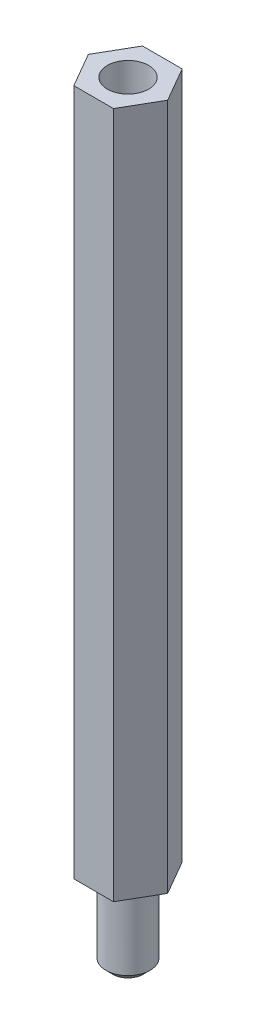
ISO-10303-21;
HEADER;
FILE_DESCRIPTION(('STEP AP214'),'2;1');
FILE_NAME('part.step','',(''),(''),'','','');
FILE_SCHEMA(('AUTOMOTIVE_DESIGN { 1 0 10303 214 1 1 1 1 }'));
ENDSEC;
DATA;
#1=APPLICATION_CONTEXT('core data for automotive mechanical design processes');
#2=APPLICATION_PROTOCOL_DEFINITION('international standard','automotive_design',2000,#1);
#3=PRODUCT_CONTEXT('',#1,'mechanical');
#4=PRODUCT('Part','Part','',(#3));
#5=PRODUCT_RELATED_PRODUCT_CATEGORY('part','',(#4));
#6=PRODUCT_DEFINITION_FORMATION('','',#4);
#7=PRODUCT_DEFINITION_CONTEXT('part definition',#1,'design');
#8=PRODUCT_DEFINITION('design','',#6,#7);
#9=PRODUCT_DEFINITION_SHAPE('','',#8);
#10=(LENGTH_UNIT() NAMED_UNIT(*) SI_UNIT(.MILLI.,.METRE.));
#11=(NAMED_UNIT(*) PLANE_ANGLE_UNIT() SI_UNIT($,.RADIAN.));
#12=(NAMED_UNIT(*) SI_UNIT($,.STERADIAN.) SOLID_ANGLE_UNIT());
#13=UNCERTAINTY_MEASURE_WITH_UNIT(LENGTH_MEASURE(1.E-05),#10,'distance_accuracy_value','');
#14=(GEOMETRIC_REPRESENTATION_CONTEXT(3) GLOBAL_UNCERTAINTY_ASSIGNED_CONTEXT((#13)) GLOBAL_UNIT_ASSIGNED_CONTEXT((#10,
#11,#12)) REPRESENTATION_CONTEXT('',''));
#15=CARTESIAN_POINT('',(0.,0.,0.));
#16=DIRECTION('',(0.,0.,1.));
#17=DIRECTION('',(1.,0.,0.));
#18=AXIS2_PLACEMENT_3D('',#15,#16,#17);
#19=CARTESIAN_POINT('',(0.,50.,0.));
#20=DIRECTION('',(0.,-1.,0.));
#21=DIRECTION('',(0.,0.,-1.));
#22=AXIS2_PLACEMENT_3D('',#19,#20,#21);
#23=CYLINDRICAL_SURFACE('',#22,1.5);
#24=CARTESIAN_POINT('',(0.,23.,0.));
#25=DIRECTION('',(0.,-1.,0.));
#26=DIRECTION('',(0.,0.,-1.));
#27=AXIS2_PLACEMENT_3D('',#24,#25,#26);
#28=CIRCLE('',#27,1.5);
#29=CARTESIAN_POINT('',(0.,23.,-1.5));
#30=VERTEX_POINT('',#29);
#31=EDGE_CURVE('E43',#30,#30,#28,.T.);
#32=ORIENTED_EDGE('',*,*,#31,.T.);
#33=EDGE_LOOP('',(#32));
#34=FACE_BOUND('',#33,.T.);
#35=CARTESIAN_POINT('',(0.,50.,0.));
#36=DIRECTION('',(0.,1.,0.));
#37=DIRECTION('',(0.,0.,1.));
#38=AXIS2_PLACEMENT_3D('',#35,#36,#37);
#39=CIRCLE('',#38,1.5);
#40=CARTESIAN_POINT('',(0.,50.,1.5));
#41=VERTEX_POINT('',#40);
#42=EDGE_CURVE('E125',#41,#41,#39,.T.);
#43=ORIENTED_EDGE('',*,*,#42,.T.);
#44=EDGE_LOOP('',(#43));
#45=FACE_BOUND('',#44,.T.);
#46=ADVANCED_FACE('F34',(#34,#45),#23,.F.);
#47=CARTESIAN_POINT('',(0.,50.,-5.));
#48=DIRECTION('',(0.,1.,0.));
#49=DIRECTION('',(0.,0.,1.));
#50=AXIS2_PLACEMENT_3D('',#47,#48,#49);
#51=PLANE('',#50);
#52=DIRECTION('',(-0.5,0.,-0.866025403784439));
#53=VECTOR('',#52,1.);
#54=CARTESIAN_POINT('',(1.44337567297406,50.,-2.5));
#55=LINE('',#54,#53);
#56=CARTESIAN_POINT('',(2.88675134594813,50.,0.));
#57=VERTEX_POINT('',#56);
#58=CARTESIAN_POINT('',(1.44337567297406,50.,-2.5));
#59=VERTEX_POINT('',#58);
#60=EDGE_CURVE('E132',#57,#59,#55,.T.);
#61=ORIENTED_EDGE('',*,*,#60,.T.);
#62=DIRECTION('',(-1.,0.,0.));
#63=VECTOR('',#62,1.);
#64=CARTESIAN_POINT('',(-1.44337567297406,50.,-2.5));
#65=LINE('',#64,#63);
#66=CARTESIAN_POINT('',(-1.44337567297406,50.,-2.5));
#67=VERTEX_POINT('',#66);
#68=EDGE_CURVE('E89',#59,#67,#65,.T.);
#69=ORIENTED_EDGE('',*,*,#68,.T.);
#70=DIRECTION('',(-0.5,0.,0.866025403784438));
#71=VECTOR('',#70,1.);
#72=CARTESIAN_POINT('',(-2.88675134594813,50.,0.));
#73=LINE('',#72,#71);
#74=CARTESIAN_POINT('',(-2.88675134594813,50.,0.));
#75=VERTEX_POINT('',#74);
#76=EDGE_CURVE('E103',#67,#75,#73,.T.);
#77=ORIENTED_EDGE('',*,*,#76,.T.);
#78=DIRECTION('',(0.5,0.,0.866025403784438));
#79=VECTOR('',#78,1.);
#80=CARTESIAN_POINT('',(-1.44337567297406,50.,2.5));
#81=LINE('',#80,#79);
#82=CARTESIAN_POINT('',(-1.44337567297406,50.,2.5));
#83=VERTEX_POINT('',#82);
#84=EDGE_CURVE('E96',#75,#83,#81,.T.);
#85=ORIENTED_EDGE('',*,*,#84,.T.);
#86=DIRECTION('',(1.,0.,0.));
#87=VECTOR('',#86,1.);
#88=CARTESIAN_POINT('',(1.44337567297406,50.,2.5));
#89=LINE('',#88,#87);
#90=CARTESIAN_POINT('',(1.44337567297406,50.,2.5));
#91=VERTEX_POINT('',#90);
#92=EDGE_CURVE('E101',#83,#91,#89,.T.);
#93=ORIENTED_EDGE('',*,*,#92,.T.);
#94=DIRECTION('',(0.5,0.,-0.866025403784439));
#95=VECTOR('',#94,1.);
#96=CARTESIAN_POINT('',(2.88675134594813,50.,0.));
#97=LINE('',#96,#95);
#98=EDGE_CURVE('E51',#91,#57,#97,.T.);
#99=ORIENTED_EDGE('',*,*,#98,.T.);
#100=EDGE_LOOP('',(#61,#69,#77,#85,#93,#99));
#101=FACE_BOUND('',#100,.T.);
#102=ORIENTED_EDGE('',*,*,#42,.F.);
#103=EDGE_LOOP('',(#102));
#104=FACE_BOUND('',#103,.T.);
#105=ADVANCED_FACE('F98',(#101,#104),#51,.T.);
#106=CARTESIAN_POINT('',(0.,0.,-5.));
#107=DIRECTION('',(0.,1.,0.));
#108=DIRECTION('',(0.,0.,1.));
#109=AXIS2_PLACEMENT_3D('',#106,#107,#108);
#110=PLANE('',#109);
#111=CARTESIAN_POINT('',(0.,0.,0.));
#112=DIRECTION('',(0.,1.,0.));
#113=DIRECTION('',(0.,0.,1.));
#114=AXIS2_PLACEMENT_3D('',#111,#112,#113);
#115=CIRCLE('',#114,2.1);
#116=CARTESIAN_POINT('',(0.,0.,2.1));
#117=VERTEX_POINT('',#116);
#118=EDGE_CURVE('E147',#117,#117,#115,.T.);
#119=ORIENTED_EDGE('',*,*,#118,.T.);
#120=EDGE_LOOP('',(#119));
#121=FACE_BOUND('',#120,.T.);
#122=DIRECTION('',(-0.5,0.,-0.866025403784439));
#123=VECTOR('',#122,1.);
#124=CARTESIAN_POINT('',(1.44337567297406,0.,-2.5));
#125=LINE('',#124,#123);
#126=CARTESIAN_POINT('',(2.88675134594813,0.,0.));
#127=VERTEX_POINT('',#126);
#128=CARTESIAN_POINT('',(1.44337567297406,0.,-2.5));
#129=VERTEX_POINT('',#128);
#130=EDGE_CURVE('E121',#127,#129,#125,.T.);
#131=ORIENTED_EDGE('',*,*,#130,.F.);
#132=DIRECTION('',(0.5,0.,-0.866025403784439));
#133=VECTOR('',#132,1.);
#134=CARTESIAN_POINT('',(2.88675134594813,0.,0.));
#135=LINE('',#134,#133);
#136=CARTESIAN_POINT('',(1.44337567297406,0.,2.5));
#137=VERTEX_POINT('',#136);
#138=EDGE_CURVE('E80',#137,#127,#135,.T.);
#139=ORIENTED_EDGE('',*,*,#138,.F.);
#140=DIRECTION('',(1.,0.,0.));
#141=VECTOR('',#140,1.);
#142=CARTESIAN_POINT('',(1.44337567297406,0.,2.5));
#143=LINE('',#142,#141);
#144=CARTESIAN_POINT('',(-1.44337567297406,0.,2.5));
#145=VERTEX_POINT('',#144);
#146=EDGE_CURVE('E74',#145,#137,#143,.T.);
#147=ORIENTED_EDGE('',*,*,#146,.F.);
#148=DIRECTION('',(0.5,0.,0.866025403784438));
#149=VECTOR('',#148,1.);
#150=CARTESIAN_POINT('',(-1.44337567297406,0.,2.5));
#151=LINE('',#150,#149);
#152=CARTESIAN_POINT('',(-2.88675134594813,0.,0.));
#153=VERTEX_POINT('',#152);
#154=EDGE_CURVE('E111',#153,#145,#151,.T.);
#155=ORIENTED_EDGE('',*,*,#154,.F.);
#156=DIRECTION('',(-0.5,0.,0.866025403784438));
#157=VECTOR('',#156,1.);
#158=CARTESIAN_POINT('',(-2.88675134594813,0.,0.));
#159=LINE('',#158,#157);
#160=CARTESIAN_POINT('',(-1.44337567297406,0.,-2.5));
#161=VERTEX_POINT('',#160);
#162=EDGE_CURVE('E127',#161,#153,#159,.T.);
#163=ORIENTED_EDGE('',*,*,#162,.F.);
#164=DIRECTION('',(-1.,0.,0.));
#165=VECTOR('',#164,1.);
#166=CARTESIAN_POINT('',(-1.44337567297406,0.,-2.5));
#167=LINE('',#166,#165);
#168=EDGE_CURVE('E124',#129,#161,#167,.T.);
#169=ORIENTED_EDGE('',*,*,#168,.F.);
#170=EDGE_LOOP('',(#131,#139,#147,#155,#163,#169));
#171=FACE_BOUND('',#170,.T.);
#172=ADVANCED_FACE('F171',(#121,#171),#110,.F.);
#173=CARTESIAN_POINT('',(1.44337567297406,50.,-2.5));
#174=DIRECTION('',(-0.866025403784439,0.,0.5));
#175=DIRECTION('',(0.5,0.,0.866025403784439));
#176=AXIS2_PLACEMENT_3D('',#173,#174,#175);
#177=PLANE('',#176);
#178=ORIENTED_EDGE('',*,*,#130,.T.);
#179=DIRECTION('',(0.,-1.,0.));
#180=VECTOR('',#179,1.);
#181=CARTESIAN_POINT('',(1.44337567297406,50.,-2.5));
#182=LINE('',#181,#180);
#183=EDGE_CURVE('E139',#59,#129,#182,.T.);
#184=ORIENTED_EDGE('',*,*,#183,.F.);
#185=ORIENTED_EDGE('',*,*,#60,.F.);
#186=DIRECTION('',(0.,-1.,0.));
#187=VECTOR('',#186,1.);
#188=CARTESIAN_POINT('',(2.88675134594813,50.,0.));
#189=LINE('',#188,#187);
#190=EDGE_CURVE('E117',#57,#127,#189,.T.);
#191=ORIENTED_EDGE('',*,*,#190,.T.);
#192=EDGE_LOOP('',(#178,#184,#185,#191));
#193=FACE_BOUND('',#192,.T.);
#194=ADVANCED_FACE('F179',(#193),#177,.F.);
#195=CARTESIAN_POINT('',(-1.44337567297406,50.,-2.5));
#196=DIRECTION('',(0.,0.,1.));
#197=DIRECTION('',(1.,0.,0.));
#198=AXIS2_PLACEMENT_3D('',#195,#196,#197);
#199=PLANE('',#198);
#200=ORIENTED_EDGE('',*,*,#168,.T.);
#201=DIRECTION('',(0.,-1.,0.));
#202=VECTOR('',#201,1.);
#203=CARTESIAN_POINT('',(-1.44337567297406,50.,-2.5));
#204=LINE('',#203,#202);
#205=EDGE_CURVE('E136',#67,#161,#204,.T.);
#206=ORIENTED_EDGE('',*,*,#205,.F.);
#207=ORIENTED_EDGE('',*,*,#68,.F.);
#208=ORIENTED_EDGE('',*,*,#183,.T.);
#209=EDGE_LOOP('',(#200,#206,#207,#208));
#210=FACE_BOUND('',#209,.T.);
#211=ADVANCED_FACE('F192',(#210),#199,.F.);
#212=CARTESIAN_POINT('',(-2.88675134594813,50.,0.));
#213=DIRECTION('',(0.866025403784438,0.,0.5));
#214=DIRECTION('',(0.5,0.,-0.866025403784439));
#215=AXIS2_PLACEMENT_3D('',#212,#213,#214);
#216=PLANE('',#215);
#217=ORIENTED_EDGE('',*,*,#162,.T.);
#218=DIRECTION('',(0.,-1.,0.));
#219=VECTOR('',#218,1.);
#220=CARTESIAN_POINT('',(-2.88675134594813,50.,0.));
#221=LINE('',#220,#219);
#222=EDGE_CURVE('E112',#75,#153,#221,.T.);
#223=ORIENTED_EDGE('',*,*,#222,.F.);
#224=ORIENTED_EDGE('',*,*,#76,.F.);
#225=ORIENTED_EDGE('',*,*,#205,.T.);
#226=EDGE_LOOP('',(#217,#223,#224,#225));
#227=FACE_BOUND('',#226,.T.);
#228=ADVANCED_FACE('F189',(#227),#216,.F.);
#229=CARTESIAN_POINT('',(-1.44337567297406,50.,2.5));
#230=DIRECTION('',(0.866025403784438,0.,-0.5));
#231=DIRECTION('',(-0.5,0.,-0.866025403784438));
#232=AXIS2_PLACEMENT_3D('',#229,#230,#231);
#233=PLANE('',#232);
#234=ORIENTED_EDGE('',*,*,#154,.T.);
#235=DIRECTION('',(0.,-1.,0.));
#236=VECTOR('',#235,1.);
#237=CARTESIAN_POINT('',(-1.44337567297406,50.,2.5));
#238=LINE('',#237,#236);
#239=EDGE_CURVE('E108',#83,#145,#238,.T.);
#240=ORIENTED_EDGE('',*,*,#239,.F.);
#241=ORIENTED_EDGE('',*,*,#84,.F.);
#242=ORIENTED_EDGE('',*,*,#222,.T.);
#243=EDGE_LOOP('',(#234,#240,#241,#242));
#244=FACE_BOUND('',#243,.T.);
#245=ADVANCED_FACE('F109',(#244),#233,.F.);
#246=CARTESIAN_POINT('',(1.44337567297406,50.,2.5));
#247=DIRECTION('',(0.,0.,-1.));
#248=DIRECTION('',(-1.,0.,0.));
#249=AXIS2_PLACEMENT_3D('',#246,#247,#248);
#250=PLANE('',#249);
#251=ORIENTED_EDGE('',*,*,#146,.T.);
#252=DIRECTION('',(0.,-1.,0.));
#253=VECTOR('',#252,1.);
#254=CARTESIAN_POINT('',(1.44337567297406,50.,2.5));
#255=LINE('',#254,#253);
#256=EDGE_CURVE('E113',#91,#137,#255,.T.);
#257=ORIENTED_EDGE('',*,*,#256,.F.);
#258=ORIENTED_EDGE('',*,*,#92,.F.);
#259=ORIENTED_EDGE('',*,*,#239,.T.);
#260=EDGE_LOOP('',(#251,#257,#258,#259));
#261=FACE_BOUND('',#260,.T.);
#262=ADVANCED_FACE('F115',(#261),#250,.F.);
#263=CARTESIAN_POINT('',(2.88675134594813,50.,0.));
#264=DIRECTION('',(-0.866025403784439,0.,-0.5));
#265=DIRECTION('',(-0.5,0.,0.866025403784439));
#266=AXIS2_PLACEMENT_3D('',#263,#264,#265);
#267=PLANE('',#266);
#268=ORIENTED_EDGE('',*,*,#138,.T.);
#269=ORIENTED_EDGE('',*,*,#190,.F.);
#270=ORIENTED_EDGE('',*,*,#98,.F.);
#271=ORIENTED_EDGE('',*,*,#256,.T.);
#272=EDGE_LOOP('',(#268,#269,#270,#271));
#273=FACE_BOUND('',#272,.T.);
#274=ADVANCED_FACE('F181',(#273),#267,.F.);
#275=CARTESIAN_POINT('',(0.,22.,0.));
#276=DIRECTION('',(0.,-1.,0.));
#277=DIRECTION('',(0.,0.,-1.));
#278=AXIS2_PLACEMENT_3D('',#275,#276,#277);
#279=PLANE('',#278);
#280=CARTESIAN_POINT('',(0.,22.,0.));
#281=DIRECTION('',(0.,-1.,0.));
#282=DIRECTION('',(0.,0.,-1.));
#283=AXIS2_PLACEMENT_3D('',#280,#281,#282);
#284=CIRCLE('',#283,0.5);
#285=CARTESIAN_POINT('',(0.,22.,-0.5));
#286=VERTEX_POINT('',#285);
#287=EDGE_CURVE('E11',#286,#286,#284,.F.);
#288=ORIENTED_EDGE('',*,*,#287,.T.);
#289=EDGE_LOOP('',(#288));
#290=FACE_BOUND('',#289,.T.);
#291=ADVANCED_FACE('F184',(#290),#279,.F.);
#292=CARTESIAN_POINT('',(0.,22.,0.));
#293=DIRECTION('',(0.,-1.,0.));
#294=DIRECTION('',(0.,0.,-1.));
#295=AXIS2_PLACEMENT_3D('',#292,#293,#294);
#296=CYLINDRICAL_SURFACE('',#295,1.6);
#297=CARTESIAN_POINT('',(0.,-0.5,0.));
#298=DIRECTION('',(0.,1.,0.));
#299=DIRECTION('',(0.,0.,1.));
#300=AXIS2_PLACEMENT_3D('',#297,#298,#299);
#301=CIRCLE('',#300,1.6);
#302=CARTESIAN_POINT('',(0.,-0.5,1.6));
#303=VERTEX_POINT('',#302);
#304=EDGE_CURVE('E150',#303,#303,#301,.F.);
#305=ORIENTED_EDGE('',*,*,#304,.T.);
#306=EDGE_LOOP('',(#305));
#307=FACE_BOUND('',#306,.T.);
#308=CARTESIAN_POINT('',(0.,-5.49999999999999,0.));
#309=DIRECTION('',(0.,-1.,0.));
#310=DIRECTION('',(0.,0.,-1.));
#311=AXIS2_PLACEMENT_3D('',#308,#309,#310);
#312=CIRCLE('',#311,1.6);
#313=CARTESIAN_POINT('',(0.,-5.49999999999999,-1.6));
#314=VERTEX_POINT('',#313);
#315=EDGE_CURVE('E144',#314,#314,#312,.F.);
#316=ORIENTED_EDGE('',*,*,#315,.T.);
#317=EDGE_LOOP('',(#316));
#318=FACE_BOUND('',#317,.T.);
#319=ADVANCED_FACE('F174',(#307,#318),#296,.T.);
#320=CARTESIAN_POINT('',(0.,-6.,0.));
#321=DIRECTION('',(0.,-1.,0.));
#322=DIRECTION('',(0.,0.,-1.));
#323=AXIS2_PLACEMENT_3D('',#320,#321,#322);
#324=PLANE('',#323);
#325=CARTESIAN_POINT('',(0.,-6.,0.));
#326=DIRECTION('',(0.,-1.,0.));
#327=DIRECTION('',(0.,0.,-1.));
#328=AXIS2_PLACEMENT_3D('',#325,#326,#327);
#329=CIRCLE('',#328,1.09999999999999);
#330=CARTESIAN_POINT('',(0.,-6.,-1.09999999999999));
#331=VERTEX_POINT('',#330);
#332=EDGE_CURVE('E141',#331,#331,#329,.T.);
#333=ORIENTED_EDGE('',*,*,#332,.T.);
#334=EDGE_LOOP('',(#333));
#335=FACE_BOUND('',#334,.T.);
#336=ADVANCED_FACE('F200',(#335),#324,.T.);
#337=CARTESIAN_POINT('',(0.,-6.,0.));
#338=DIRECTION('',(0.,1.,0.));
#339=DIRECTION('',(0.,0.,1.));
#340=AXIS2_PLACEMENT_3D('',#337,#338,#339);
#341=CONICAL_SURFACE('',#340,1.09999999999999,0.785398163397451);
#342=ORIENTED_EDGE('',*,*,#315,.F.);
#343=EDGE_LOOP('',(#342));
#344=FACE_BOUND('',#343,.T.);
#345=ORIENTED_EDGE('',*,*,#332,.F.);
#346=EDGE_LOOP('',(#345));
#347=FACE_BOUND('',#346,.T.);
#348=ADVANCED_FACE('F163',(#344,#347),#341,.T.);
#349=CARTESIAN_POINT('',(0.,-0.5,0.));
#350=DIRECTION('',(0.,1.,0.));
#351=DIRECTION('',(0.,0.,1.));
#352=AXIS2_PLACEMENT_3D('',#349,#350,#351);
#353=TOROIDAL_SURFACE('',#352,2.1,0.5);
#354=ORIENTED_EDGE('',*,*,#304,.F.);
#355=EDGE_LOOP('',(#354));
#356=FACE_BOUND('',#355,.T.);
#357=ORIENTED_EDGE('',*,*,#118,.F.);
#358=EDGE_LOOP('',(#357));
#359=FACE_BOUND('',#358,.T.);
#360=ADVANCED_FACE('F158',(#356,#359),#353,.F.);
#361=CARTESIAN_POINT('',(0.,23.,0.));
#362=DIRECTION('',(0.,-1.,0.));
#363=DIRECTION('',(0.,0.,-1.));
#364=AXIS2_PLACEMENT_3D('',#361,#362,#363);
#365=DEGENERATE_TOROIDAL_SURFACE('',#364,0.5,1.,.T.);
#366=ORIENTED_EDGE('',*,*,#287,.F.);
#367=EDGE_LOOP('',(#366));
#368=FACE_BOUND('',#367,.T.);
#369=ORIENTED_EDGE('',*,*,#31,.F.);
#370=EDGE_LOOP('',(#369));
#371=FACE_BOUND('',#370,.T.);
#372=ADVANCED_FACE('F36',(#368,#371),#365,.F.);
#373=CLOSED_SHELL('',(#46,#105,#172,#194,#211,#228,#245,#262,#274,#291,#319,#336,#348,#360,#372));
#374=MANIFOLD_SOLID_BREP('B2',#373);
#375=ADVANCED_BREP_SHAPE_REPRESENTATION('',(#18,#374),#14);
#376=SHAPE_DEFINITION_REPRESENTATION(#9,#375);
ENDSEC;
END-ISO-10303-21;
